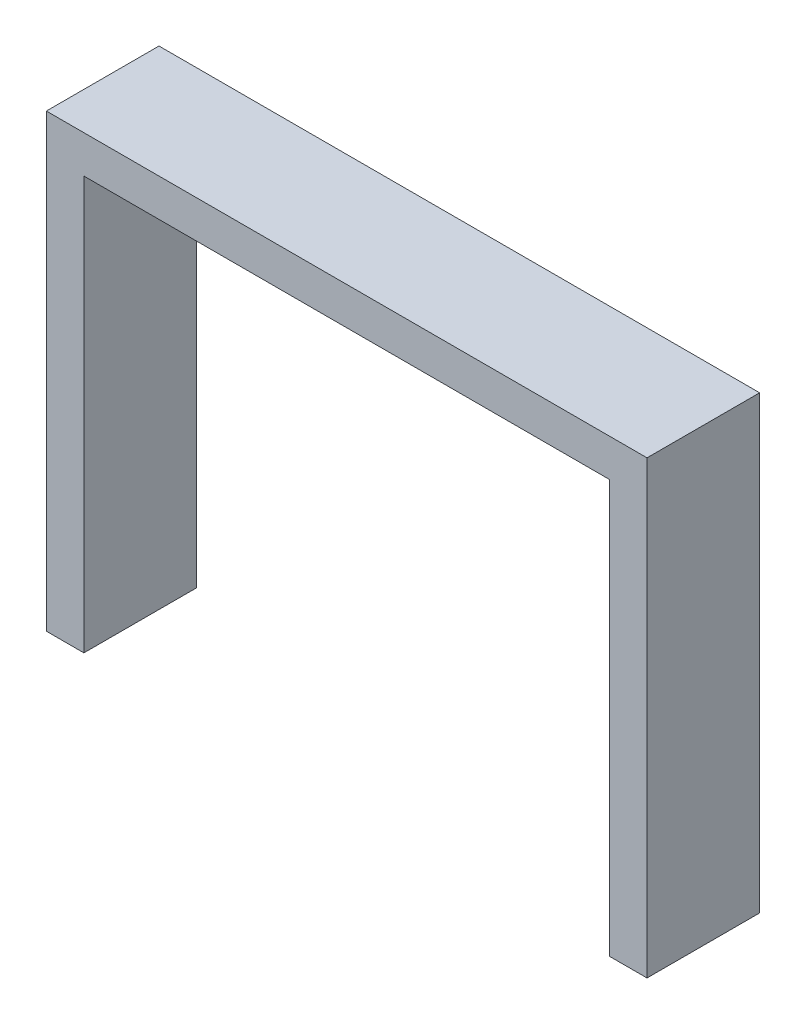
ISO-10303-21;
HEADER;
FILE_DESCRIPTION(('STEP AP214'),'2;1');
FILE_NAME('part.step','',(''),(''),'','','');
FILE_SCHEMA(('AUTOMOTIVE_DESIGN { 1 0 10303 214 1 1 1 1 }'));
ENDSEC;
DATA;
#1=APPLICATION_CONTEXT('core data for automotive mechanical design processes');
#2=APPLICATION_PROTOCOL_DEFINITION('international standard','automotive_design',2000,#1);
#3=PRODUCT_CONTEXT('',#1,'mechanical');
#4=PRODUCT('Part','Part','',(#3));
#5=PRODUCT_RELATED_PRODUCT_CATEGORY('part','',(#4));
#6=PRODUCT_DEFINITION_FORMATION('','',#4);
#7=PRODUCT_DEFINITION_CONTEXT('part definition',#1,'design');
#8=PRODUCT_DEFINITION('design','',#6,#7);
#9=PRODUCT_DEFINITION_SHAPE('','',#8);
#10=(LENGTH_UNIT() NAMED_UNIT(*) SI_UNIT(.MILLI.,.METRE.));
#11=(NAMED_UNIT(*) PLANE_ANGLE_UNIT() SI_UNIT($,.RADIAN.));
#12=(NAMED_UNIT(*) SI_UNIT($,.STERADIAN.) SOLID_ANGLE_UNIT());
#13=UNCERTAINTY_MEASURE_WITH_UNIT(LENGTH_MEASURE(1.E-05),#10,'distance_accuracy_value','');
#14=(GEOMETRIC_REPRESENTATION_CONTEXT(3) GLOBAL_UNCERTAINTY_ASSIGNED_CONTEXT((#13)) GLOBAL_UNIT_ASSIGNED_CONTEXT((#10,
#11,#12)) REPRESENTATION_CONTEXT('',''));
#15=CARTESIAN_POINT('',(0.,0.,0.));
#16=DIRECTION('',(0.,0.,1.));
#17=DIRECTION('',(1.,0.,0.));
#18=AXIS2_PLACEMENT_3D('',#15,#16,#17);
#19=CARTESIAN_POINT('',(-28.,24.0394736842105,-12.75));
#20=DIRECTION('',(0.,1.,0.));
#21=DIRECTION('',(-1.,0.,0.));
#22=AXIS2_PLACEMENT_3D('',#19,#20,#21);
#23=PLANE('',#22);
#24=DIRECTION('',(-1.,0.,0.));
#25=VECTOR('',#24,1.);
#26=CARTESIAN_POINT('',(-28.,24.0394736842105,-2.25));
#27=LINE('',#26,#25);
#28=CARTESIAN_POINT('',(28.,24.0394736842105,-2.25));
#29=VERTEX_POINT('',#28);
#30=CARTESIAN_POINT('',(-28.,24.0394736842105,-2.25));
#31=VERTEX_POINT('',#30);
#32=EDGE_CURVE('E138',#29,#31,#27,.T.);
#33=ORIENTED_EDGE('',*,*,#32,.F.);
#34=DIRECTION('',(0.,0.,1.));
#35=VECTOR('',#34,1.);
#36=CARTESIAN_POINT('',(28.,24.0394736842105,-12.75));
#37=LINE('',#36,#35);
#38=CARTESIAN_POINT('',(28.,24.0394736842105,-12.75));
#39=VERTEX_POINT('',#38);
#40=EDGE_CURVE('E12',#39,#29,#37,.T.);
#41=ORIENTED_EDGE('',*,*,#40,.F.);
#42=DIRECTION('',(-1.,0.,0.));
#43=VECTOR('',#42,1.);
#44=CARTESIAN_POINT('',(-28.,24.0394736842105,-12.75));
#45=LINE('',#44,#43);
#46=CARTESIAN_POINT('',(-28.,24.0394736842105,-12.75));
#47=VERTEX_POINT('',#46);
#48=EDGE_CURVE('E158',#39,#47,#45,.T.);
#49=ORIENTED_EDGE('',*,*,#48,.T.);
#50=DIRECTION('',(0.,0.,1.));
#51=VECTOR('',#50,1.);
#52=CARTESIAN_POINT('',(-28.,24.0394736842105,-12.75));
#53=LINE('',#52,#51);
#54=EDGE_CURVE('E44',#47,#31,#53,.T.);
#55=ORIENTED_EDGE('',*,*,#54,.T.);
#56=EDGE_LOOP('',(#33,#41,#49,#55));
#57=FACE_BOUND('',#56,.T.);
#58=ADVANCED_FACE('F41',(#57),#23,.T.);
#59=CARTESIAN_POINT('',(28.,-17.9605263157895,-12.75));
#60=DIRECTION('',(1.,0.,0.));
#61=DIRECTION('',(0.,0.,-1.));
#62=AXIS2_PLACEMENT_3D('',#59,#60,#61);
#63=PLANE('',#62);
#64=DIRECTION('',(0.,1.,0.));
#65=VECTOR('',#64,1.);
#66=CARTESIAN_POINT('',(28.,-17.9605263157895,-2.25));
#67=LINE('',#66,#65);
#68=CARTESIAN_POINT('',(28.,-17.9605263157895,-2.25));
#69=VERTEX_POINT('',#68);
#70=EDGE_CURVE('E156',#69,#29,#67,.T.);
#71=ORIENTED_EDGE('',*,*,#70,.F.);
#72=DIRECTION('',(0.,0.,1.));
#73=VECTOR('',#72,1.);
#74=CARTESIAN_POINT('',(28.,-17.9605263157895,-12.75));
#75=LINE('',#74,#73);
#76=CARTESIAN_POINT('',(28.,-17.9605263157895,-12.75));
#77=VERTEX_POINT('',#76);
#78=EDGE_CURVE('E50',#77,#69,#75,.T.);
#79=ORIENTED_EDGE('',*,*,#78,.F.);
#80=DIRECTION('',(0.,1.,0.));
#81=VECTOR('',#80,1.);
#82=CARTESIAN_POINT('',(28.,-17.9605263157895,-12.75));
#83=LINE('',#82,#81);
#84=EDGE_CURVE('E128',#77,#39,#83,.T.);
#85=ORIENTED_EDGE('',*,*,#84,.T.);
#86=ORIENTED_EDGE('',*,*,#40,.T.);
#87=EDGE_LOOP('',(#71,#79,#85,#86));
#88=FACE_BOUND('',#87,.T.);
#89=ADVANCED_FACE('F170',(#88),#63,.T.);
#90=CARTESIAN_POINT('',(24.5,-17.9605263157895,-12.75));
#91=DIRECTION('',(0.,-1.,0.));
#92=DIRECTION('',(1.,0.,0.));
#93=AXIS2_PLACEMENT_3D('',#90,#91,#92);
#94=PLANE('',#93);
#95=DIRECTION('',(1.,0.,0.));
#96=VECTOR('',#95,1.);
#97=CARTESIAN_POINT('',(24.5,-17.9605263157895,-2.25));
#98=LINE('',#97,#96);
#99=CARTESIAN_POINT('',(24.5,-17.9605263157895,-2.25));
#100=VERTEX_POINT('',#99);
#101=EDGE_CURVE('E115',#100,#69,#98,.T.);
#102=ORIENTED_EDGE('',*,*,#101,.F.);
#103=DIRECTION('',(0.,0.,1.));
#104=VECTOR('',#103,1.);
#105=CARTESIAN_POINT('',(24.5,-17.9605263157895,-12.75));
#106=LINE('',#105,#104);
#107=CARTESIAN_POINT('',(24.5,-17.9605263157895,-12.75));
#108=VERTEX_POINT('',#107);
#109=EDGE_CURVE('E110',#108,#100,#106,.T.);
#110=ORIENTED_EDGE('',*,*,#109,.F.);
#111=DIRECTION('',(1.,0.,0.));
#112=VECTOR('',#111,1.);
#113=CARTESIAN_POINT('',(24.5,-17.9605263157895,-12.75));
#114=LINE('',#113,#112);
#115=EDGE_CURVE('E113',#108,#77,#114,.T.);
#116=ORIENTED_EDGE('',*,*,#115,.T.);
#117=ORIENTED_EDGE('',*,*,#78,.T.);
#118=EDGE_LOOP('',(#102,#110,#116,#117));
#119=FACE_BOUND('',#118,.T.);
#120=ADVANCED_FACE('F112',(#119),#94,.T.);
#121=CARTESIAN_POINT('',(24.5,20.5394736842105,-12.75));
#122=DIRECTION('',(-1.,0.,0.));
#123=DIRECTION('',(0.,-1.,0.));
#124=AXIS2_PLACEMENT_3D('',#121,#122,#123);
#125=PLANE('',#124);
#126=DIRECTION('',(0.,-1.,0.));
#127=VECTOR('',#126,1.);
#128=CARTESIAN_POINT('',(24.5,20.5394736842105,-2.25));
#129=LINE('',#128,#127);
#130=CARTESIAN_POINT('',(24.5,20.5394736842105,-2.25));
#131=VERTEX_POINT('',#130);
#132=EDGE_CURVE('E153',#131,#100,#129,.T.);
#133=ORIENTED_EDGE('',*,*,#132,.F.);
#134=DIRECTION('',(0.,0.,1.));
#135=VECTOR('',#134,1.);
#136=CARTESIAN_POINT('',(24.5,20.5394736842105,-12.75));
#137=LINE('',#136,#135);
#138=CARTESIAN_POINT('',(24.5,20.5394736842105,-12.75));
#139=VERTEX_POINT('',#138);
#140=EDGE_CURVE('E120',#139,#131,#137,.T.);
#141=ORIENTED_EDGE('',*,*,#140,.F.);
#142=DIRECTION('',(0.,-1.,0.));
#143=VECTOR('',#142,1.);
#144=CARTESIAN_POINT('',(24.5,20.5394736842105,-12.75));
#145=LINE('',#144,#143);
#146=EDGE_CURVE('E126',#139,#108,#145,.T.);
#147=ORIENTED_EDGE('',*,*,#146,.T.);
#148=ORIENTED_EDGE('',*,*,#109,.T.);
#149=EDGE_LOOP('',(#133,#141,#147,#148));
#150=FACE_BOUND('',#149,.T.);
#151=ADVANCED_FACE('F130',(#150),#125,.T.);
#152=CARTESIAN_POINT('',(-24.5,20.5394736842105,-12.75));
#153=DIRECTION('',(0.,-1.,0.));
#154=DIRECTION('',(1.,0.,0.));
#155=AXIS2_PLACEMENT_3D('',#152,#153,#154);
#156=PLANE('',#155);
#157=DIRECTION('',(1.,0.,0.));
#158=VECTOR('',#157,1.);
#159=CARTESIAN_POINT('',(-24.5,20.5394736842105,-2.25));
#160=LINE('',#159,#158);
#161=CARTESIAN_POINT('',(-24.5,20.5394736842105,-2.25));
#162=VERTEX_POINT('',#161);
#163=EDGE_CURVE('E150',#162,#131,#160,.T.);
#164=ORIENTED_EDGE('',*,*,#163,.F.);
#165=DIRECTION('',(0.,0.,1.));
#166=VECTOR('',#165,1.);
#167=CARTESIAN_POINT('',(-24.5,20.5394736842105,-12.75));
#168=LINE('',#167,#166);
#169=CARTESIAN_POINT('',(-24.5,20.5394736842105,-12.75));
#170=VERTEX_POINT('',#169);
#171=EDGE_CURVE('E162',#170,#162,#168,.T.);
#172=ORIENTED_EDGE('',*,*,#171,.F.);
#173=DIRECTION('',(1.,0.,0.));
#174=VECTOR('',#173,1.);
#175=CARTESIAN_POINT('',(-24.5,20.5394736842105,-12.75));
#176=LINE('',#175,#174);
#177=EDGE_CURVE('E131',#170,#139,#176,.T.);
#178=ORIENTED_EDGE('',*,*,#177,.T.);
#179=ORIENTED_EDGE('',*,*,#140,.T.);
#180=EDGE_LOOP('',(#164,#172,#178,#179));
#181=FACE_BOUND('',#180,.T.);
#182=ADVANCED_FACE('F183',(#181),#156,.T.);
#183=CARTESIAN_POINT('',(-24.5,20.5394736842105,-12.75));
#184=DIRECTION('',(1.,0.,0.));
#185=DIRECTION('',(0.,1.,0.));
#186=AXIS2_PLACEMENT_3D('',#183,#184,#185);
#187=PLANE('',#186);
#188=DIRECTION('',(0.,1.,0.));
#189=VECTOR('',#188,1.);
#190=CARTESIAN_POINT('',(-24.5,20.5394736842105,-2.25));
#191=LINE('',#190,#189);
#192=CARTESIAN_POINT('',(-24.5,-17.9605263157895,-2.25));
#193=VERTEX_POINT('',#192);
#194=EDGE_CURVE('E147',#193,#162,#191,.T.);
#195=ORIENTED_EDGE('',*,*,#194,.F.);
#196=DIRECTION('',(0.,0.,1.));
#197=VECTOR('',#196,1.);
#198=CARTESIAN_POINT('',(-24.5,-17.9605263157895,-12.75));
#199=LINE('',#198,#197);
#200=CARTESIAN_POINT('',(-24.5,-17.9605263157895,-12.75));
#201=VERTEX_POINT('',#200);
#202=EDGE_CURVE('E164',#201,#193,#199,.T.);
#203=ORIENTED_EDGE('',*,*,#202,.F.);
#204=DIRECTION('',(0.,1.,0.));
#205=VECTOR('',#204,1.);
#206=CARTESIAN_POINT('',(-24.5,20.5394736842105,-12.75));
#207=LINE('',#206,#205);
#208=EDGE_CURVE('E133',#201,#170,#207,.T.);
#209=ORIENTED_EDGE('',*,*,#208,.T.);
#210=ORIENTED_EDGE('',*,*,#171,.T.);
#211=EDGE_LOOP('',(#195,#203,#209,#210));
#212=FACE_BOUND('',#211,.T.);
#213=ADVANCED_FACE('F186',(#212),#187,.T.);
#214=CARTESIAN_POINT('',(-28.,-17.9605263157895,-12.75));
#215=DIRECTION('',(0.,-1.,0.));
#216=DIRECTION('',(0.,0.,-1.));
#217=AXIS2_PLACEMENT_3D('',#214,#215,#216);
#218=PLANE('',#217);
#219=DIRECTION('',(1.,0.,0.));
#220=VECTOR('',#219,1.);
#221=CARTESIAN_POINT('',(-28.,-17.9605263157895,-2.25));
#222=LINE('',#221,#220);
#223=CARTESIAN_POINT('',(-28.,-17.9605263157895,-2.25));
#224=VERTEX_POINT('',#223);
#225=EDGE_CURVE('E144',#224,#193,#222,.T.);
#226=ORIENTED_EDGE('',*,*,#225,.F.);
#227=DIRECTION('',(0.,0.,1.));
#228=VECTOR('',#227,1.);
#229=CARTESIAN_POINT('',(-28.,-17.9605263157895,-12.75));
#230=LINE('',#229,#228);
#231=CARTESIAN_POINT('',(-28.,-17.9605263157895,-12.75));
#232=VERTEX_POINT('',#231);
#233=EDGE_CURVE('E165',#232,#224,#230,.T.);
#234=ORIENTED_EDGE('',*,*,#233,.F.);
#235=DIRECTION('',(1.,0.,0.));
#236=VECTOR('',#235,1.);
#237=CARTESIAN_POINT('',(-28.,-17.9605263157895,-12.75));
#238=LINE('',#237,#236);
#239=EDGE_CURVE('E261',#232,#201,#238,.T.);
#240=ORIENTED_EDGE('',*,*,#239,.T.);
#241=ORIENTED_EDGE('',*,*,#202,.T.);
#242=EDGE_LOOP('',(#226,#234,#240,#241));
#243=FACE_BOUND('',#242,.T.);
#244=ADVANCED_FACE('F190',(#243),#218,.T.);
#245=CARTESIAN_POINT('',(-28.,-17.9605263157895,-12.75));
#246=DIRECTION('',(-1.,0.,0.));
#247=DIRECTION('',(0.,0.,1.));
#248=AXIS2_PLACEMENT_3D('',#245,#246,#247);
#249=PLANE('',#248);
#250=DIRECTION('',(0.,-1.,0.));
#251=VECTOR('',#250,1.);
#252=CARTESIAN_POINT('',(-28.,-17.9605263157895,-2.25));
#253=LINE('',#252,#251);
#254=EDGE_CURVE('E141',#31,#224,#253,.T.);
#255=ORIENTED_EDGE('',*,*,#254,.F.);
#256=ORIENTED_EDGE('',*,*,#54,.F.);
#257=DIRECTION('',(0.,-1.,0.));
#258=VECTOR('',#257,1.);
#259=CARTESIAN_POINT('',(-28.,-17.9605263157895,-12.75));
#260=LINE('',#259,#258);
#261=EDGE_CURVE('E262',#47,#232,#260,.T.);
#262=ORIENTED_EDGE('',*,*,#261,.T.);
#263=ORIENTED_EDGE('',*,*,#233,.T.);
#264=EDGE_LOOP('',(#255,#256,#262,#263));
#265=FACE_BOUND('',#264,.T.);
#266=ADVANCED_FACE('F167',(#265),#249,.T.);
#267=CARTESIAN_POINT('',(0.,3.03947368421053,-12.75));
#268=DIRECTION('',(0.,0.,1.));
#269=DIRECTION('',(1.,0.,0.));
#270=AXIS2_PLACEMENT_3D('',#267,#268,#269);
#271=PLANE('',#270);
#272=ORIENTED_EDGE('',*,*,#48,.F.);
#273=ORIENTED_EDGE('',*,*,#84,.F.);
#274=ORIENTED_EDGE('',*,*,#115,.F.);
#275=ORIENTED_EDGE('',*,*,#146,.F.);
#276=ORIENTED_EDGE('',*,*,#177,.F.);
#277=ORIENTED_EDGE('',*,*,#208,.F.);
#278=ORIENTED_EDGE('',*,*,#239,.F.);
#279=ORIENTED_EDGE('',*,*,#261,.F.);
#280=EDGE_LOOP('',(#272,#273,#274,#275,#276,#277,#278,#279));
#281=FACE_BOUND('',#280,.T.);
#282=ADVANCED_FACE('F124',(#281),#271,.F.);
#283=CARTESIAN_POINT('',(0.,3.03947368421053,-2.25));
#284=DIRECTION('',(0.,0.,1.));
#285=DIRECTION('',(1.,0.,0.));
#286=AXIS2_PLACEMENT_3D('',#283,#284,#285);
#287=PLANE('',#286);
#288=ORIENTED_EDGE('',*,*,#32,.T.);
#289=ORIENTED_EDGE('',*,*,#254,.T.);
#290=ORIENTED_EDGE('',*,*,#225,.T.);
#291=ORIENTED_EDGE('',*,*,#194,.T.);
#292=ORIENTED_EDGE('',*,*,#163,.T.);
#293=ORIENTED_EDGE('',*,*,#132,.T.);
#294=ORIENTED_EDGE('',*,*,#101,.T.);
#295=ORIENTED_EDGE('',*,*,#70,.T.);
#296=EDGE_LOOP('',(#288,#289,#290,#291,#292,#293,#294,#295));
#297=FACE_BOUND('',#296,.T.);
#298=ADVANCED_FACE('F169',(#297),#287,.T.);
#299=CLOSED_SHELL('',(#58,#89,#120,#151,#182,#213,#244,#266,#282,#298));
#300=MANIFOLD_SOLID_BREP('B2',#299);
#301=ADVANCED_BREP_SHAPE_REPRESENTATION('',(#18,#300),#14);
#302=SHAPE_DEFINITION_REPRESENTATION(#9,#301);
ENDSEC;
END-ISO-10303-21;
